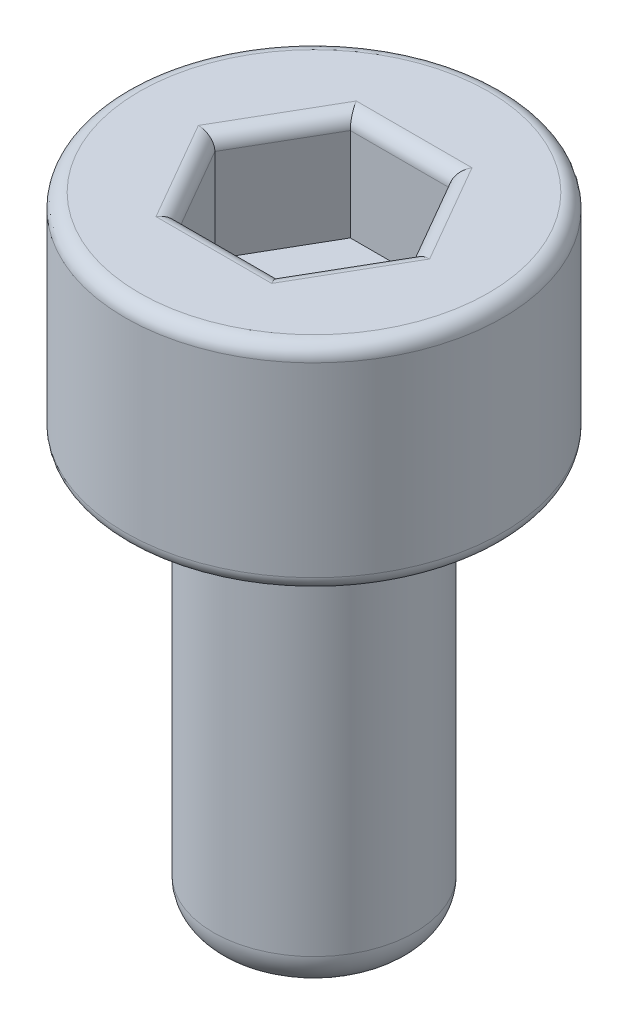
ISO-10303-21;
HEADER;
FILE_DESCRIPTION(('STEP AP214'),'2;1');
FILE_NAME('part.step','',(''),(''),'','','');
FILE_SCHEMA(('AUTOMOTIVE_DESIGN { 1 0 10303 214 1 1 1 1 }'));
ENDSEC;
DATA;
#1=APPLICATION_CONTEXT('core data for automotive mechanical design processes');
#2=APPLICATION_PROTOCOL_DEFINITION('international standard','automotive_design',2000,#1);
#3=PRODUCT_CONTEXT('',#1,'mechanical');
#4=PRODUCT('Part','Part','',(#3));
#5=PRODUCT_RELATED_PRODUCT_CATEGORY('part','',(#4));
#6=PRODUCT_DEFINITION_FORMATION('','',#4);
#7=PRODUCT_DEFINITION_CONTEXT('part definition',#1,'design');
#8=PRODUCT_DEFINITION('design','',#6,#7);
#9=PRODUCT_DEFINITION_SHAPE('','',#8);
#10=(LENGTH_UNIT() NAMED_UNIT(*) SI_UNIT(.MILLI.,.METRE.));
#11=(NAMED_UNIT(*) PLANE_ANGLE_UNIT() SI_UNIT($,.RADIAN.));
#12=(NAMED_UNIT(*) SI_UNIT($,.STERADIAN.) SOLID_ANGLE_UNIT());
#13=UNCERTAINTY_MEASURE_WITH_UNIT(LENGTH_MEASURE(1.E-05),#10,'distance_accuracy_value','');
#14=(GEOMETRIC_REPRESENTATION_CONTEXT(3) GLOBAL_UNCERTAINTY_ASSIGNED_CONTEXT((#13)) GLOBAL_UNIT_ASSIGNED_CONTEXT((#10,
#11,#12)) REPRESENTATION_CONTEXT('',''));
#15=CARTESIAN_POINT('',(0.,0.,0.));
#16=DIRECTION('',(0.,0.,1.));
#17=DIRECTION('',(1.,0.,0.));
#18=AXIS2_PLACEMENT_3D('',#15,#16,#17);
#19=CARTESIAN_POINT('',(0.,3.,0.));
#20=DIRECTION('',(0.,-1.,0.));
#21=DIRECTION('',(0.,0.,-1.));
#22=AXIS2_PLACEMENT_3D('',#19,#20,#21);
#23=CYLINDRICAL_SURFACE('',#22,2.64);
#24=CARTESIAN_POINT('',(0.,2.8,0.));
#25=DIRECTION('',(0.,1.,0.));
#26=DIRECTION('',(0.,0.,1.));
#27=AXIS2_PLACEMENT_3D('',#24,#25,#26);
#28=CIRCLE('',#27,2.64);
#29=CARTESIAN_POINT('',(0.,2.8,2.64));
#30=VERTEX_POINT('',#29);
#31=EDGE_CURVE('E185',#30,#30,#28,.F.);
#32=ORIENTED_EDGE('',*,*,#31,.T.);
#33=EDGE_LOOP('',(#32));
#34=FACE_BOUND('',#33,.T.);
#35=CARTESIAN_POINT('',(0.,0.2,0.));
#36=DIRECTION('',(0.,1.,0.));
#37=DIRECTION('',(0.,0.,1.));
#38=AXIS2_PLACEMENT_3D('',#35,#36,#37);
#39=CIRCLE('',#38,2.64);
#40=CARTESIAN_POINT('',(0.,0.2,2.64));
#41=VERTEX_POINT('',#40);
#42=EDGE_CURVE('E181',#41,#41,#39,.T.);
#43=ORIENTED_EDGE('',*,*,#42,.T.);
#44=EDGE_LOOP('',(#43));
#45=FACE_BOUND('',#44,.T.);
#46=ADVANCED_FACE('F38',(#34,#45),#23,.T.);
#47=CARTESIAN_POINT('',(0.,3.,0.));
#48=DIRECTION('',(0.,1.,0.));
#49=DIRECTION('',(0.,0.,1.));
#50=AXIS2_PLACEMENT_3D('',#47,#48,#49);
#51=PLANE('',#50);
#52=DIRECTION('',(-1.,0.,0.));
#53=VECTOR('',#52,1.);
#54=CARTESIAN_POINT('',(0.692820323027551,3.,-1.4));
#55=LINE('',#54,#53);
#56=CARTESIAN_POINT('',(-0.808290376865475,3.,-1.4));
#57=VERTEX_POINT('',#56);
#58=CARTESIAN_POINT('',(0.808290376865476,3.,-1.4));
#59=VERTEX_POINT('',#58);
#60=EDGE_CURVE('E208',#57,#59,#55,.F.);
#61=ORIENTED_EDGE('',*,*,#60,.T.);
#62=DIRECTION('',(-0.5,0.,-0.866025403784439));
#63=VECTOR('',#62,1.);
#64=CARTESIAN_POINT('',(1.55884572681199,3.,-0.0999999999999999));
#65=LINE('',#64,#63);
#66=CARTESIAN_POINT('',(1.61658075373095,3.,0.));
#67=VERTEX_POINT('',#66);
#68=EDGE_CURVE('E211',#59,#67,#65,.F.);
#69=ORIENTED_EDGE('',*,*,#68,.T.);
#70=DIRECTION('',(0.5,0.,-0.866025403784439));
#71=VECTOR('',#70,1.);
#72=CARTESIAN_POINT('',(0.866025403784438,3.,1.3));
#73=LINE('',#72,#71);
#74=CARTESIAN_POINT('',(0.808290376865476,3.,1.4));
#75=VERTEX_POINT('',#74);
#76=EDGE_CURVE('E196',#67,#75,#73,.F.);
#77=ORIENTED_EDGE('',*,*,#76,.T.);
#78=DIRECTION('',(1.,0.,0.));
#79=VECTOR('',#78,1.);
#80=CARTESIAN_POINT('',(-0.692820323027551,3.,1.4));
#81=LINE('',#80,#79);
#82=CARTESIAN_POINT('',(-0.808290376865476,3.,1.4));
#83=VERTEX_POINT('',#82);
#84=EDGE_CURVE('E199',#75,#83,#81,.F.);
#85=ORIENTED_EDGE('',*,*,#84,.T.);
#86=DIRECTION('',(0.5,0.,0.866025403784439));
#87=VECTOR('',#86,1.);
#88=CARTESIAN_POINT('',(-1.55884572681199,3.,0.1));
#89=LINE('',#88,#87);
#90=CARTESIAN_POINT('',(-1.61658075373095,3.,0.));
#91=VERTEX_POINT('',#90);
#92=EDGE_CURVE('E202',#83,#91,#89,.F.);
#93=ORIENTED_EDGE('',*,*,#92,.T.);
#94=DIRECTION('',(-0.5,0.,0.866025403784439));
#95=VECTOR('',#94,1.);
#96=CARTESIAN_POINT('',(-0.866025403784438,3.,-1.3));
#97=LINE('',#96,#95);
#98=EDGE_CURVE('E205',#91,#57,#97,.F.);
#99=ORIENTED_EDGE('',*,*,#98,.T.);
#100=EDGE_LOOP('',(#61,#69,#77,#85,#93,#99));
#101=FACE_BOUND('',#100,.T.);
#102=CARTESIAN_POINT('',(0.,3.,0.));
#103=DIRECTION('',(0.,1.,0.));
#104=DIRECTION('',(0.,0.,1.));
#105=AXIS2_PLACEMENT_3D('',#102,#103,#104);
#106=CIRCLE('',#105,2.44);
#107=CARTESIAN_POINT('',(0.,3.,2.44));
#108=VERTEX_POINT('',#107);
#109=EDGE_CURVE('E177',#108,#108,#106,.T.);
#110=ORIENTED_EDGE('',*,*,#109,.T.);
#111=EDGE_LOOP('',(#110));
#112=FACE_BOUND('',#111,.T.);
#113=ADVANCED_FACE('F260',(#101,#112),#51,.T.);
#114=CARTESIAN_POINT('',(0.,0.,0.));
#115=DIRECTION('',(0.,1.,0.));
#116=DIRECTION('',(0.,0.,1.));
#117=AXIS2_PLACEMENT_3D('',#114,#115,#116);
#118=PLANE('',#117);
#119=CARTESIAN_POINT('',(0.,0.,0.));
#120=DIRECTION('',(0.,1.,0.));
#121=DIRECTION('',(0.,0.,1.));
#122=AXIS2_PLACEMENT_3D('',#119,#120,#121);
#123=CIRCLE('',#122,2.44);
#124=CARTESIAN_POINT('',(0.,0.,2.44));
#125=VERTEX_POINT('',#124);
#126=EDGE_CURVE('E189',#125,#125,#123,.F.);
#127=ORIENTED_EDGE('',*,*,#126,.T.);
#128=EDGE_LOOP('',(#127));
#129=FACE_BOUND('',#128,.T.);
#130=CARTESIAN_POINT('',(0.,0.,0.));
#131=DIRECTION('',(0.,-1.,0.));
#132=DIRECTION('',(0.,0.,-1.));
#133=AXIS2_PLACEMENT_3D('',#130,#131,#132);
#134=CIRCLE('',#133,1.405);
#135=CARTESIAN_POINT('',(0.,0.,1.405));
#136=VERTEX_POINT('',#135);
#137=EDGE_CURVE('E161',#136,#136,#134,.T.);
#138=ORIENTED_EDGE('',*,*,#137,.F.);
#139=EDGE_LOOP('',(#138));
#140=FACE_BOUND('',#139,.T.);
#141=ADVANCED_FACE('F267',(#129,#140),#118,.F.);
#142=CARTESIAN_POINT('',(0.,-5.76,0.));
#143=DIRECTION('',(0.,1.,0.));
#144=DIRECTION('',(0.,0.,1.));
#145=AXIS2_PLACEMENT_3D('',#142,#143,#144);
#146=CYLINDRICAL_SURFACE('',#145,1.405);
#147=CARTESIAN_POINT('',(0.,-5.26,0.));
#148=DIRECTION('',(0.,-1.,0.));
#149=DIRECTION('',(0.,0.,-1.));
#150=AXIS2_PLACEMENT_3D('',#147,#148,#149);
#151=CIRCLE('',#150,1.405);
#152=CARTESIAN_POINT('',(0.,-5.26,1.405));
#153=VERTEX_POINT('',#152);
#154=EDGE_CURVE('E11',#153,#153,#151,.F.);
#155=CARTESIAN_POINT('',(0.,-5.26,1.405));
#156=CARTESIAN_POINT('',(0.,-5.20520833333333,1.405));
#157=CARTESIAN_POINT('',(0.,-5.15041666666666,1.405));
#158=CARTESIAN_POINT('',(0.,-5.04083333333333,1.405));
#159=CARTESIAN_POINT('',(0.,-4.98604166666666,1.405));
#160=CARTESIAN_POINT('',(0.,-4.87645833333333,1.405));
#161=CARTESIAN_POINT('',(0.,-4.82166666666667,1.405));
#162=CARTESIAN_POINT('',(0.,-4.71208333333333,1.405));
#163=CARTESIAN_POINT('',(0.,-4.65729166666667,1.405));
#164=CARTESIAN_POINT('',(0.,-4.54770833333333,1.405));
#165=CARTESIAN_POINT('',(0.,-4.49291666666667,1.405));
#166=CARTESIAN_POINT('',(0.,-4.38333333333333,1.405));
#167=CARTESIAN_POINT('',(0.,-4.32854166666667,1.405));
#168=CARTESIAN_POINT('',(0.,-4.21895833333333,1.405));
#169=CARTESIAN_POINT('',(0.,-4.16416666666666,1.405));
#170=CARTESIAN_POINT('',(0.,-4.05458333333333,1.405));
#171=CARTESIAN_POINT('',(0.,-3.99979166666667,1.405));
#172=CARTESIAN_POINT('',(0.,-3.89020833333333,1.405));
#173=CARTESIAN_POINT('',(0.,-3.83541666666667,1.405));
#174=CARTESIAN_POINT('',(0.,-3.72583333333333,1.405));
#175=CARTESIAN_POINT('',(0.,-3.67104166666667,1.405));
#176=CARTESIAN_POINT('',(0.,-3.56145833333333,1.405));
#177=CARTESIAN_POINT('',(0.,-3.50666666666667,1.405));
#178=CARTESIAN_POINT('',(0.,-3.39708333333333,1.405));
#179=CARTESIAN_POINT('',(0.,-3.34229166666667,1.405));
#180=CARTESIAN_POINT('',(0.,-3.23270833333333,1.405));
#181=CARTESIAN_POINT('',(0.,-3.17791666666667,1.405));
#182=CARTESIAN_POINT('',(0.,-3.06833333333333,1.405));
#183=CARTESIAN_POINT('',(0.,-3.01354166666667,1.405));
#184=CARTESIAN_POINT('',(0.,-2.90395833333333,1.405));
#185=CARTESIAN_POINT('',(0.,-2.84916666666667,1.405));
#186=CARTESIAN_POINT('',(0.,-2.73958333333333,1.405));
#187=CARTESIAN_POINT('',(0.,-2.68479166666667,1.405));
#188=CARTESIAN_POINT('',(0.,-2.57520833333333,1.405));
#189=CARTESIAN_POINT('',(0.,-2.52041666666667,1.405));
#190=CARTESIAN_POINT('',(0.,-2.41083333333333,1.405));
#191=CARTESIAN_POINT('',(0.,-2.35604166666667,1.405));
#192=CARTESIAN_POINT('',(0.,-2.24645833333333,1.405));
#193=CARTESIAN_POINT('',(0.,-2.19166666666667,1.405));
#194=CARTESIAN_POINT('',(0.,-2.08208333333333,1.405));
#195=CARTESIAN_POINT('',(0.,-2.02729166666667,1.405));
#196=CARTESIAN_POINT('',(0.,-1.91770833333333,1.405));
#197=CARTESIAN_POINT('',(0.,-1.86291666666667,1.405));
#198=CARTESIAN_POINT('',(0.,-1.75333333333333,1.405));
#199=CARTESIAN_POINT('',(0.,-1.69854166666667,1.405));
#200=CARTESIAN_POINT('',(0.,-1.58895833333333,1.405));
#201=CARTESIAN_POINT('',(0.,-1.53416666666667,1.405));
#202=CARTESIAN_POINT('',(0.,-1.42458333333333,1.405));
#203=CARTESIAN_POINT('',(0.,-1.36979166666667,1.405));
#204=CARTESIAN_POINT('',(0.,-1.26020833333333,1.405));
#205=CARTESIAN_POINT('',(0.,-1.20541666666667,1.405));
#206=CARTESIAN_POINT('',(0.,-1.09583333333333,1.405));
#207=CARTESIAN_POINT('',(0.,-1.04104166666667,1.405));
#208=CARTESIAN_POINT('',(0.,-0.931458333333332,1.405));
#209=CARTESIAN_POINT('',(0.,-0.876666666666666,1.405));
#210=CARTESIAN_POINT('',(0.,-0.767083333333332,1.405));
#211=CARTESIAN_POINT('',(0.,-0.712291666666666,1.405));
#212=CARTESIAN_POINT('',(0.,-0.602708333333332,1.405));
#213=CARTESIAN_POINT('',(0.,-0.547916666666666,1.405));
#214=CARTESIAN_POINT('',(0.,-0.438333333333332,1.405));
#215=CARTESIAN_POINT('',(0.,-0.383541666666666,1.405));
#216=CARTESIAN_POINT('',(0.,-0.273958333333332,1.405));
#217=CARTESIAN_POINT('',(0.,-0.219166666666666,1.405));
#218=CARTESIAN_POINT('',(0.,-0.109583333333332,1.405));
#219=CARTESIAN_POINT('',(0.,-0.0547916666666656,1.405));
#220=CARTESIAN_POINT('',(0.,0.,1.405));
#221=B_SPLINE_CURVE_WITH_KNOTS('',3,(#155,#156,#157,#158,#159,#160,#161,#162,#163,#164,#165,
#166,#167,#168,#169,#170,#171,#172,#173,#174,#175,#176,#177,#178,#179,#180,#181,#182,#183,#184,
#185,#186,#187,#188,#189,#190,#191,#192,#193,#194,#195,#196,#197,#198,#199,#200,#201,#202,#203,
#204,#205,#206,#207,#208,#209,#210,#211,#212,#213,#214,#215,#216,#217,#218,#219,#220),
.UNSPECIFIED.,.F.,.F.,(4,2,2,2,2,2,2,2,2,2,2,2,2,2,2,2,2,2,2,2,2,2,2,2,2,2,2,2,2,2,2,2,4),(0.,
0.164375,0.32875,0.493125,0.657499999999999,0.821875,0.986249999999999,1.150625,1.315,1.479375,
1.64375,1.808125,1.9725,2.136875,2.30125,2.465625,2.63,2.794375,2.95875,3.123125,3.2875,
3.451875,3.61625,3.780625,3.945,4.109375,4.27375,4.438125,4.6025,4.766875,4.93125,5.095625,
5.26),.UNSPECIFIED.);
#222=EDGE_CURVE('BSEAM342',#153,#136,#221,.T.);
#223=ORIENTED_EDGE('',*,*,#154,.T.);
#224=ORIENTED_EDGE('',*,*,#137,.T.);
#225=ORIENTED_EDGE('',*,*,#222,.T.);
#226=ORIENTED_EDGE('',*,*,#222,.F.);
#227=EDGE_LOOP('',(#223,#225,#224,#226));
#228=FACE_BOUND('',#227,.T.);
#229=ADVANCED_FACE('F342',(#228),#146,.T.);
#230=CARTESIAN_POINT('',(0.,-5.76,0.));
#231=DIRECTION('',(0.,-1.,0.));
#232=DIRECTION('',(0.,0.,-1.));
#233=AXIS2_PLACEMENT_3D('',#230,#231,#232);
#234=PLANE('',#233);
#235=CARTESIAN_POINT('',(0.,-5.76,0.));
#236=DIRECTION('',(0.,-1.,0.));
#237=DIRECTION('',(0.,0.,-1.));
#238=AXIS2_PLACEMENT_3D('',#235,#236,#237);
#239=CIRCLE('',#238,0.905);
#240=CARTESIAN_POINT('',(0.,-5.76,-0.905));
#241=VERTEX_POINT('',#240);
#242=EDGE_CURVE('E47',#241,#241,#239,.T.);
#243=ORIENTED_EDGE('',*,*,#242,.T.);
#244=EDGE_LOOP('',(#243));
#245=FACE_BOUND('',#244,.T.);
#246=ADVANCED_FACE('F247',(#245),#234,.T.);
#247=CARTESIAN_POINT('',(0.,2.8,0.));
#248=DIRECTION('',(0.,1.,0.));
#249=DIRECTION('',(0.,0.,1.));
#250=AXIS2_PLACEMENT_3D('',#247,#248,#249);
#251=TOROIDAL_SURFACE('',#250,2.44,0.2);
#252=ORIENTED_EDGE('',*,*,#31,.F.);
#253=EDGE_LOOP('',(#252));
#254=FACE_BOUND('',#253,.T.);
#255=ORIENTED_EDGE('',*,*,#109,.F.);
#256=EDGE_LOOP('',(#255));
#257=FACE_BOUND('',#256,.T.);
#258=ADVANCED_FACE('F273',(#254,#257),#251,.T.);
#259=CARTESIAN_POINT('',(0.,0.2,0.));
#260=DIRECTION('',(0.,1.,0.));
#261=DIRECTION('',(0.,0.,1.));
#262=AXIS2_PLACEMENT_3D('',#259,#260,#261);
#263=TOROIDAL_SURFACE('',#262,2.44,0.2);
#264=ORIENTED_EDGE('',*,*,#126,.F.);
#265=EDGE_LOOP('',(#264));
#266=FACE_BOUND('',#265,.T.);
#267=ORIENTED_EDGE('',*,*,#42,.F.);
#268=EDGE_LOOP('',(#267));
#269=FACE_BOUND('',#268,.T.);
#270=ADVANCED_FACE('F276',(#266,#269),#263,.T.);
#271=CARTESIAN_POINT('',(0.692820323027551,1.5,1.2));
#272=DIRECTION('',(0.866025403784439,0.,0.5));
#273=DIRECTION('',(0.5,0.,-0.866025403784439));
#274=AXIS2_PLACEMENT_3D('',#271,#272,#273);
#275=PLANE('',#274);
#276=DIRECTION('',(0.,1.,0.));
#277=VECTOR('',#276,1.);
#278=CARTESIAN_POINT('',(0.692820323027551,1.5,1.2));
#279=LINE('',#278,#277);
#280=CARTESIAN_POINT('',(0.692820323027551,1.5,1.2));
#281=VERTEX_POINT('',#280);
#282=CARTESIAN_POINT('',(0.692820323027551,2.8,1.2));
#283=VERTEX_POINT('',#282);
#284=EDGE_CURVE('E158',#281,#283,#279,.T.);
#285=ORIENTED_EDGE('',*,*,#284,.T.);
#286=DIRECTION('',(0.5,0.,-0.866025403784439));
#287=VECTOR('',#286,1.);
#288=CARTESIAN_POINT('',(1.3856406460551,2.8,0.));
#289=LINE('',#288,#287);
#290=CARTESIAN_POINT('',(1.3856406460551,2.8,0.));
#291=VERTEX_POINT('',#290);
#292=EDGE_CURVE('E118',#283,#291,#289,.T.);
#293=ORIENTED_EDGE('',*,*,#292,.T.);
#294=DIRECTION('',(0.,1.,0.));
#295=VECTOR('',#294,1.);
#296=CARTESIAN_POINT('',(1.3856406460551,1.5,0.));
#297=LINE('',#296,#295);
#298=CARTESIAN_POINT('',(1.3856406460551,1.5,0.));
#299=VERTEX_POINT('',#298);
#300=EDGE_CURVE('E111',#299,#291,#297,.T.);
#301=ORIENTED_EDGE('',*,*,#300,.F.);
#302=DIRECTION('',(0.5,0.,-0.866025403784439));
#303=VECTOR('',#302,1.);
#304=CARTESIAN_POINT('',(0.692820323027551,1.5,1.2));
#305=LINE('',#304,#303);
#306=EDGE_CURVE('E115',#281,#299,#305,.T.);
#307=ORIENTED_EDGE('',*,*,#306,.F.);
#308=EDGE_LOOP('',(#285,#293,#301,#307));
#309=FACE_BOUND('',#308,.T.);
#310=ADVANCED_FACE('F113',(#309),#275,.F.);
#311=CARTESIAN_POINT('',(-0.692820323027551,1.5,1.2));
#312=DIRECTION('',(0.,0.,1.));
#313=DIRECTION('',(1.,0.,0.));
#314=AXIS2_PLACEMENT_3D('',#311,#312,#313);
#315=PLANE('',#314);
#316=DIRECTION('',(0.,1.,0.));
#317=VECTOR('',#316,1.);
#318=CARTESIAN_POINT('',(-0.692820323027551,1.5,1.2));
#319=LINE('',#318,#317);
#320=CARTESIAN_POINT('',(-0.692820323027551,1.5,1.2));
#321=VERTEX_POINT('',#320);
#322=CARTESIAN_POINT('',(-0.692820323027551,2.8,1.2));
#323=VERTEX_POINT('',#322);
#324=EDGE_CURVE('E162',#321,#323,#319,.T.);
#325=ORIENTED_EDGE('',*,*,#324,.T.);
#326=DIRECTION('',(1.,0.,0.));
#327=VECTOR('',#326,1.);
#328=CARTESIAN_POINT('',(0.692820323027551,2.8,1.2));
#329=LINE('',#328,#327);
#330=EDGE_CURVE('E54',#323,#283,#329,.T.);
#331=ORIENTED_EDGE('',*,*,#330,.T.);
#332=ORIENTED_EDGE('',*,*,#284,.F.);
#333=DIRECTION('',(1.,0.,0.));
#334=VECTOR('',#333,1.);
#335=CARTESIAN_POINT('',(-0.692820323027551,1.5,1.2));
#336=LINE('',#335,#334);
#337=EDGE_CURVE('E124',#321,#281,#336,.T.);
#338=ORIENTED_EDGE('',*,*,#337,.F.);
#339=EDGE_LOOP('',(#325,#331,#332,#338));
#340=FACE_BOUND('',#339,.T.);
#341=ADVANCED_FACE('F324',(#340),#315,.F.);
#342=CARTESIAN_POINT('',(-1.3856406460551,1.5,0.));
#343=DIRECTION('',(-0.866025403784439,0.,0.5));
#344=DIRECTION('',(0.5,0.,0.866025403784439));
#345=AXIS2_PLACEMENT_3D('',#342,#343,#344);
#346=PLANE('',#345);
#347=DIRECTION('',(0.,1.,0.));
#348=VECTOR('',#347,1.);
#349=CARTESIAN_POINT('',(-1.3856406460551,1.5,0.));
#350=LINE('',#349,#348);
#351=CARTESIAN_POINT('',(-1.3856406460551,1.5,0.));
#352=VERTEX_POINT('',#351);
#353=CARTESIAN_POINT('',(-1.3856406460551,2.8,0.));
#354=VERTEX_POINT('',#353);
#355=EDGE_CURVE('E165',#352,#354,#350,.T.);
#356=ORIENTED_EDGE('',*,*,#355,.T.);
#357=DIRECTION('',(0.5,0.,0.866025403784439));
#358=VECTOR('',#357,1.);
#359=CARTESIAN_POINT('',(-0.692820323027551,2.8,1.2));
#360=LINE('',#359,#358);
#361=EDGE_CURVE('E62',#354,#323,#360,.T.);
#362=ORIENTED_EDGE('',*,*,#361,.T.);
#363=ORIENTED_EDGE('',*,*,#324,.F.);
#364=DIRECTION('',(0.5,0.,0.866025403784439));
#365=VECTOR('',#364,1.);
#366=CARTESIAN_POINT('',(-1.3856406460551,1.5,0.));
#367=LINE('',#366,#365);
#368=EDGE_CURVE('E153',#352,#321,#367,.T.);
#369=ORIENTED_EDGE('',*,*,#368,.F.);
#370=EDGE_LOOP('',(#356,#362,#363,#369));
#371=FACE_BOUND('',#370,.T.);
#372=ADVANCED_FACE('F323',(#371),#346,.F.);
#373=CARTESIAN_POINT('',(-0.69282032302755,1.5,-1.2));
#374=DIRECTION('',(-0.866025403784439,0.,-0.5));
#375=DIRECTION('',(-0.5,0.,0.866025403784439));
#376=AXIS2_PLACEMENT_3D('',#373,#374,#375);
#377=PLANE('',#376);
#378=DIRECTION('',(0.,1.,0.));
#379=VECTOR('',#378,1.);
#380=CARTESIAN_POINT('',(-0.69282032302755,1.5,-1.2));
#381=LINE('',#380,#379);
#382=CARTESIAN_POINT('',(-0.69282032302755,1.5,-1.2));
#383=VERTEX_POINT('',#382);
#384=CARTESIAN_POINT('',(-0.69282032302755,2.8,-1.2));
#385=VERTEX_POINT('',#384);
#386=EDGE_CURVE('E168',#383,#385,#381,.T.);
#387=ORIENTED_EDGE('',*,*,#386,.T.);
#388=DIRECTION('',(-0.5,0.,0.866025403784439));
#389=VECTOR('',#388,1.);
#390=CARTESIAN_POINT('',(-1.3856406460551,2.8,0.));
#391=LINE('',#390,#389);
#392=EDGE_CURVE('E218',#385,#354,#391,.T.);
#393=ORIENTED_EDGE('',*,*,#392,.T.);
#394=ORIENTED_EDGE('',*,*,#355,.F.);
#395=DIRECTION('',(-0.5,0.,0.866025403784439));
#396=VECTOR('',#395,1.);
#397=CARTESIAN_POINT('',(-0.69282032302755,1.5,-1.2));
#398=LINE('',#397,#396);
#399=EDGE_CURVE('E149',#383,#352,#398,.T.);
#400=ORIENTED_EDGE('',*,*,#399,.F.);
#401=EDGE_LOOP('',(#387,#393,#394,#400));
#402=FACE_BOUND('',#401,.T.);
#403=ADVANCED_FACE('F322',(#402),#377,.F.);
#404=CARTESIAN_POINT('',(0.692820323027551,1.5,-1.2));
#405=DIRECTION('',(0.,0.,-1.));
#406=DIRECTION('',(-1.,0.,0.));
#407=AXIS2_PLACEMENT_3D('',#404,#405,#406);
#408=PLANE('',#407);
#409=DIRECTION('',(0.,1.,0.));
#410=VECTOR('',#409,1.);
#411=CARTESIAN_POINT('',(0.692820323027551,1.5,-1.2));
#412=LINE('',#411,#410);
#413=CARTESIAN_POINT('',(0.692820323027551,1.5,-1.2));
#414=VERTEX_POINT('',#413);
#415=CARTESIAN_POINT('',(0.692820323027551,2.8,-1.2));
#416=VERTEX_POINT('',#415);
#417=EDGE_CURVE('E123',#414,#416,#412,.T.);
#418=ORIENTED_EDGE('',*,*,#417,.T.);
#419=DIRECTION('',(-1.,0.,0.));
#420=VECTOR('',#419,1.);
#421=CARTESIAN_POINT('',(-0.69282032302755,2.8,-1.2));
#422=LINE('',#421,#420);
#423=EDGE_CURVE('E215',#416,#385,#422,.T.);
#424=ORIENTED_EDGE('',*,*,#423,.T.);
#425=ORIENTED_EDGE('',*,*,#386,.F.);
#426=DIRECTION('',(-1.,0.,0.));
#427=VECTOR('',#426,1.);
#428=CARTESIAN_POINT('',(0.692820323027551,1.5,-1.2));
#429=LINE('',#428,#427);
#430=EDGE_CURVE('E134',#414,#383,#429,.T.);
#431=ORIENTED_EDGE('',*,*,#430,.F.);
#432=EDGE_LOOP('',(#418,#424,#425,#431));
#433=FACE_BOUND('',#432,.T.);
#434=ADVANCED_FACE('F318',(#433),#408,.F.);
#435=CARTESIAN_POINT('',(1.3856406460551,1.5,0.));
#436=DIRECTION('',(0.866025403784439,0.,-0.5));
#437=DIRECTION('',(-0.5,0.,-0.866025403784439));
#438=AXIS2_PLACEMENT_3D('',#435,#436,#437);
#439=PLANE('',#438);
#440=ORIENTED_EDGE('',*,*,#300,.T.);
#441=DIRECTION('',(-0.5,0.,-0.866025403784439));
#442=VECTOR('',#441,1.);
#443=CARTESIAN_POINT('',(0.692820323027551,2.8,-1.2));
#444=LINE('',#443,#442);
#445=EDGE_CURVE('E193',#291,#416,#444,.T.);
#446=ORIENTED_EDGE('',*,*,#445,.T.);
#447=ORIENTED_EDGE('',*,*,#417,.F.);
#448=DIRECTION('',(-0.5,0.,-0.866025403784439));
#449=VECTOR('',#448,1.);
#450=CARTESIAN_POINT('',(1.3856406460551,1.5,0.));
#451=LINE('',#450,#449);
#452=EDGE_CURVE('E127',#299,#414,#451,.T.);
#453=ORIENTED_EDGE('',*,*,#452,.F.);
#454=EDGE_LOOP('',(#440,#446,#447,#453));
#455=FACE_BOUND('',#454,.T.);
#456=ADVANCED_FACE('F128',(#455),#439,.F.);
#457=CARTESIAN_POINT('',(0.,1.5,0.));
#458=DIRECTION('',(0.,1.,0.));
#459=DIRECTION('',(0.,0.,1.));
#460=AXIS2_PLACEMENT_3D('',#457,#458,#459);
#461=PLANE('',#460);
#462=ORIENTED_EDGE('',*,*,#306,.T.);
#463=ORIENTED_EDGE('',*,*,#452,.T.);
#464=ORIENTED_EDGE('',*,*,#430,.T.);
#465=ORIENTED_EDGE('',*,*,#399,.T.);
#466=ORIENTED_EDGE('',*,*,#368,.T.);
#467=ORIENTED_EDGE('',*,*,#337,.T.);
#468=EDGE_LOOP('',(#462,#463,#464,#465,#466,#467));
#469=FACE_BOUND('',#468,.T.);
#470=ADVANCED_FACE('F136',(#469),#461,.T.);
#471=CARTESIAN_POINT('',(-1.55884572681199,2.8,0.1));
#472=DIRECTION('',(-0.5,0.,-0.866025403784439));
#473=DIRECTION('',(-0.866025403784439,0.,0.5));
#474=AXIS2_PLACEMENT_3D('',#471,#472,#473);
#475=CYLINDRICAL_SURFACE('',#474,0.2);
#476=CARTESIAN_POINT('',(-1.61658075373095,2.8,0.));
#477=DIRECTION('',(0.,0.,-1.));
#478=DIRECTION('',(1.,0.,0.));
#479=AXIS2_PLACEMENT_3D('',#476,#477,#478);
#480=ELLIPSE('',#479,0.23094010767585,0.2);
#481=EDGE_CURVE('E144',#91,#354,#480,.T.);
#482=ORIENTED_EDGE('',*,*,#481,.F.);
#483=ORIENTED_EDGE('',*,*,#92,.F.);
#484=CARTESIAN_POINT('',(-0.808290376865476,2.8,1.4));
#485=DIRECTION('',(-0.866025403784438,0.,-0.5));
#486=DIRECTION('',(0.5,0.,-0.866025403784439));
#487=AXIS2_PLACEMENT_3D('',#484,#485,#486);
#488=ELLIPSE('',#487,0.23094010767585,0.2);
#489=EDGE_CURVE('E140',#323,#83,#488,.F.);
#490=ORIENTED_EDGE('',*,*,#489,.F.);
#491=ORIENTED_EDGE('',*,*,#361,.F.);
#492=EDGE_LOOP('',(#482,#483,#490,#491));
#493=FACE_BOUND('',#492,.T.);
#494=ADVANCED_FACE('F294',(#493),#475,.T.);
#495=CARTESIAN_POINT('',(-0.692820323027551,2.8,1.4));
#496=DIRECTION('',(-1.,0.,0.));
#497=DIRECTION('',(0.,0.,1.));
#498=AXIS2_PLACEMENT_3D('',#495,#496,#497);
#499=CYLINDRICAL_SURFACE('',#498,0.2);
#500=ORIENTED_EDGE('',*,*,#489,.T.);
#501=ORIENTED_EDGE('',*,*,#84,.F.);
#502=CARTESIAN_POINT('',(0.808290376865476,2.8,1.4));
#503=DIRECTION('',(-0.866025403784439,0.,0.5));
#504=DIRECTION('',(-0.5,0.,-0.866025403784439));
#505=AXIS2_PLACEMENT_3D('',#502,#503,#504);
#506=ELLIPSE('',#505,0.23094010767585,0.2);
#507=EDGE_CURVE('E237',#283,#75,#506,.F.);
#508=ORIENTED_EDGE('',*,*,#507,.F.);
#509=ORIENTED_EDGE('',*,*,#330,.F.);
#510=EDGE_LOOP('',(#500,#501,#508,#509));
#511=FACE_BOUND('',#510,.T.);
#512=ADVANCED_FACE('F291',(#511),#499,.T.);
#513=CARTESIAN_POINT('',(-0.866025403784438,2.8,-1.3));
#514=DIRECTION('',(0.5,0.,-0.866025403784439));
#515=DIRECTION('',(-0.866025403784439,0.,-0.5));
#516=AXIS2_PLACEMENT_3D('',#513,#514,#515);
#517=CYLINDRICAL_SURFACE('',#516,0.2);
#518=ORIENTED_EDGE('',*,*,#481,.T.);
#519=ORIENTED_EDGE('',*,*,#392,.F.);
#520=CARTESIAN_POINT('',(-0.808290376865475,2.8,-1.4));
#521=DIRECTION('',(0.866025403784439,0.,-0.5));
#522=DIRECTION('',(0.5,0.,0.866025403784439));
#523=AXIS2_PLACEMENT_3D('',#520,#521,#522);
#524=ELLIPSE('',#523,0.23094010767585,0.2);
#525=EDGE_CURVE('E233',#57,#385,#524,.T.);
#526=ORIENTED_EDGE('',*,*,#525,.F.);
#527=ORIENTED_EDGE('',*,*,#98,.F.);
#528=EDGE_LOOP('',(#518,#519,#526,#527));
#529=FACE_BOUND('',#528,.T.);
#530=ADVANCED_FACE('F287',(#529),#517,.T.);
#531=CARTESIAN_POINT('',(0.866025403784438,2.8,1.3));
#532=DIRECTION('',(-0.5,0.,0.866025403784439));
#533=DIRECTION('',(0.866025403784439,0.,0.5));
#534=AXIS2_PLACEMENT_3D('',#531,#532,#533);
#535=CYLINDRICAL_SURFACE('',#534,0.2);
#536=ORIENTED_EDGE('',*,*,#507,.T.);
#537=ORIENTED_EDGE('',*,*,#76,.F.);
#538=CARTESIAN_POINT('',(1.61658075373095,2.8,0.));
#539=DIRECTION('',(0.,0.,1.));
#540=DIRECTION('',(1.,0.,0.));
#541=AXIS2_PLACEMENT_3D('',#538,#539,#540);
#542=ELLIPSE('',#541,0.23094010767585,0.2);
#543=EDGE_CURVE('E230',#291,#67,#542,.F.);
#544=ORIENTED_EDGE('',*,*,#543,.F.);
#545=ORIENTED_EDGE('',*,*,#292,.F.);
#546=EDGE_LOOP('',(#536,#537,#544,#545));
#547=FACE_BOUND('',#546,.T.);
#548=ADVANCED_FACE('F283',(#547),#535,.T.);
#549=CARTESIAN_POINT('',(0.692820323027551,2.8,-1.4));
#550=DIRECTION('',(1.,0.,0.));
#551=DIRECTION('',(0.,0.,-1.));
#552=AXIS2_PLACEMENT_3D('',#549,#550,#551);
#553=CYLINDRICAL_SURFACE('',#552,0.2);
#554=ORIENTED_EDGE('',*,*,#525,.T.);
#555=ORIENTED_EDGE('',*,*,#423,.F.);
#556=CARTESIAN_POINT('',(0.808290376865476,2.8,-1.4));
#557=DIRECTION('',(0.866025403784439,0.,0.5));
#558=DIRECTION('',(-0.5,0.,0.866025403784439));
#559=AXIS2_PLACEMENT_3D('',#556,#557,#558);
#560=ELLIPSE('',#559,0.23094010767585,0.2);
#561=EDGE_CURVE('E227',#59,#416,#560,.T.);
#562=ORIENTED_EDGE('',*,*,#561,.F.);
#563=ORIENTED_EDGE('',*,*,#60,.F.);
#564=EDGE_LOOP('',(#554,#555,#562,#563));
#565=FACE_BOUND('',#564,.T.);
#566=ADVANCED_FACE('F255',(#565),#553,.T.);
#567=CARTESIAN_POINT('',(1.55884572681199,2.8,-0.0999999999999997));
#568=DIRECTION('',(0.5,0.,0.866025403784439));
#569=DIRECTION('',(0.866025403784439,0.,-0.5));
#570=AXIS2_PLACEMENT_3D('',#567,#568,#569);
#571=CYLINDRICAL_SURFACE('',#570,0.2);
#572=ORIENTED_EDGE('',*,*,#543,.T.);
#573=ORIENTED_EDGE('',*,*,#68,.F.);
#574=ORIENTED_EDGE('',*,*,#561,.T.);
#575=ORIENTED_EDGE('',*,*,#445,.F.);
#576=EDGE_LOOP('',(#572,#573,#574,#575));
#577=FACE_BOUND('',#576,.T.);
#578=ADVANCED_FACE('F250',(#577),#571,.T.);
#579=CARTESIAN_POINT('',(0.,-5.26,0.));
#580=DIRECTION('',(0.,-1.,0.));
#581=DIRECTION('',(0.,0.,-1.));
#582=AXIS2_PLACEMENT_3D('',#579,#580,#581);
#583=TOROIDAL_SURFACE('',#582,0.905,0.5);
#584=ORIENTED_EDGE('',*,*,#154,.F.);
#585=EDGE_LOOP('',(#584));
#586=FACE_BOUND('',#585,.T.);
#587=ORIENTED_EDGE('',*,*,#242,.F.);
#588=EDGE_LOOP('',(#587));
#589=FACE_BOUND('',#588,.T.);
#590=ADVANCED_FACE('F40',(#586,#589),#583,.T.);
#591=CLOSED_SHELL('',(#46,#113,#141,#229,#246,#258,#270,#310,#341,#372,#403,#434,#456,#470,#494,
#512,#530,#548,#566,#578,#590));
#592=MANIFOLD_SOLID_BREP('B2',#591);
#593=ADVANCED_BREP_SHAPE_REPRESENTATION('',(#18,#592),#14);
#594=SHAPE_DEFINITION_REPRESENTATION(#9,#593);
ENDSEC;
END-ISO-10303-21;
